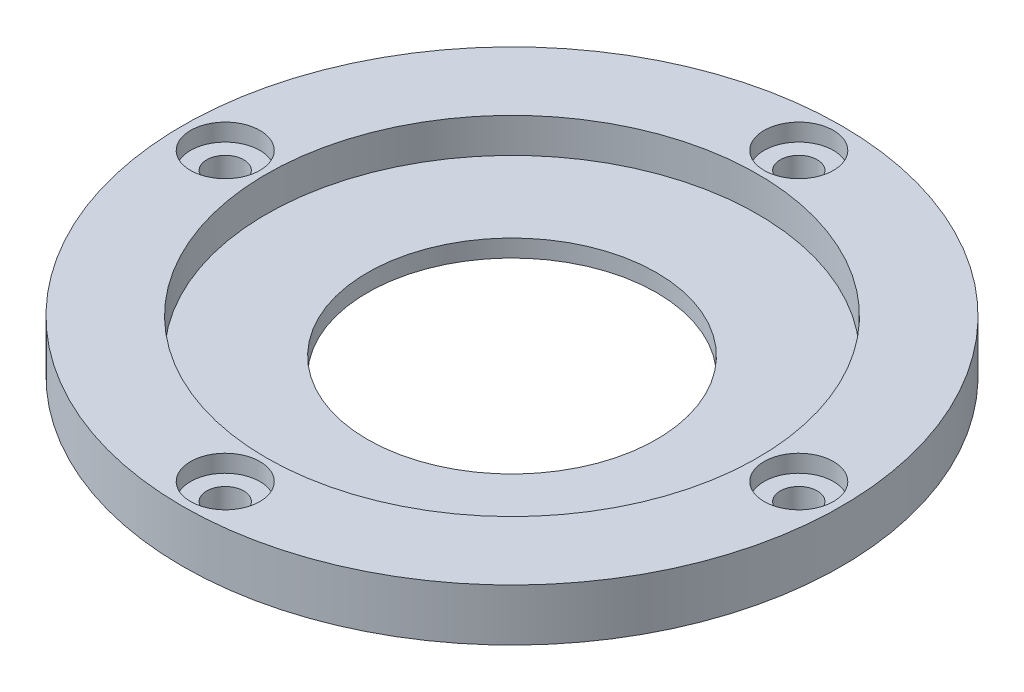
ISO-10303-21;
HEADER;
FILE_DESCRIPTION(('STEP AP214'),'2;1');
FILE_NAME('part.step','',(''),(''),'','','');
FILE_SCHEMA(('AUTOMOTIVE_DESIGN { 1 0 10303 214 1 1 1 1 }'));
ENDSEC;
DATA;
#1=APPLICATION_CONTEXT('core data for automotive mechanical design processes');
#2=APPLICATION_PROTOCOL_DEFINITION('international standard','automotive_design',2000,#1);
#3=PRODUCT_CONTEXT('',#1,'mechanical');
#4=PRODUCT('Part','Part','',(#3));
#5=PRODUCT_RELATED_PRODUCT_CATEGORY('part','',(#4));
#6=PRODUCT_DEFINITION_FORMATION('','',#4);
#7=PRODUCT_DEFINITION_CONTEXT('part definition',#1,'design');
#8=PRODUCT_DEFINITION('design','',#6,#7);
#9=PRODUCT_DEFINITION_SHAPE('','',#8);
#10=(LENGTH_UNIT() NAMED_UNIT(*) SI_UNIT(.MILLI.,.METRE.));
#11=(NAMED_UNIT(*) PLANE_ANGLE_UNIT() SI_UNIT($,.RADIAN.));
#12=(NAMED_UNIT(*) SI_UNIT($,.STERADIAN.) SOLID_ANGLE_UNIT());
#13=UNCERTAINTY_MEASURE_WITH_UNIT(LENGTH_MEASURE(1.E-05),#10,'distance_accuracy_value','');
#14=(GEOMETRIC_REPRESENTATION_CONTEXT(3) GLOBAL_UNCERTAINTY_ASSIGNED_CONTEXT((#13)) GLOBAL_UNIT_ASSIGNED_CONTEXT((#10,
#11,#12)) REPRESENTATION_CONTEXT('',''));
#15=CARTESIAN_POINT('',(0.,0.,0.));
#16=DIRECTION('',(0.,0.,1.));
#17=DIRECTION('',(1.,0.,0.));
#18=AXIS2_PLACEMENT_3D('',#15,#16,#17);
#19=CARTESIAN_POINT('',(0.,1.5,0.));
#20=DIRECTION('',(0.,1.,0.));
#21=DIRECTION('',(0.,0.,1.));
#22=AXIS2_PLACEMENT_3D('',#19,#20,#21);
#23=PLANE('',#22);
#24=CARTESIAN_POINT('',(0.,1.5,0.));
#25=DIRECTION('',(0.,1.,0.));
#26=DIRECTION('',(0.,0.,1.));
#27=AXIS2_PLACEMENT_3D('',#24,#25,#26);
#28=CIRCLE('',#27,12.5);
#29=CARTESIAN_POINT('',(0.,1.5,12.5));
#30=VERTEX_POINT('',#29);
#31=EDGE_CURVE('E40',#30,#30,#28,.T.);
#32=ORIENTED_EDGE('',*,*,#31,.F.);
#33=EDGE_LOOP('',(#32));
#34=FACE_BOUND('',#33,.T.);
#35=CARTESIAN_POINT('',(0.,1.5,0.));
#36=DIRECTION('',(0.,1.,0.));
#37=DIRECTION('',(0.,0.,1.));
#38=AXIS2_PLACEMENT_3D('',#35,#36,#37);
#39=CIRCLE('',#38,21.25);
#40=CARTESIAN_POINT('',(0.,1.5,21.25));
#41=VERTEX_POINT('',#40);
#42=EDGE_CURVE('E54',#41,#41,#39,.T.);
#43=ORIENTED_EDGE('',*,*,#42,.T.);
#44=EDGE_LOOP('',(#43));
#45=FACE_BOUND('',#44,.T.);
#46=ADVANCED_FACE('F33',(#34,#45),#23,.T.);
#47=CARTESIAN_POINT('',(0.,0.,0.));
#48=DIRECTION('',(0.,1.,0.));
#49=DIRECTION('',(0.,0.,1.));
#50=AXIS2_PLACEMENT_3D('',#47,#48,#49);
#51=PLANE('',#50);
#52=CARTESIAN_POINT('',(0.,0.,-24.8));
#53=DIRECTION('',(0.,1.,0.));
#54=DIRECTION('',(0.,0.,1.));
#55=AXIS2_PLACEMENT_3D('',#52,#53,#54);
#56=CIRCLE('',#55,1.6);
#57=CARTESIAN_POINT('',(0.,0.,-23.2));
#58=VERTEX_POINT('',#57);
#59=EDGE_CURVE('E64',#58,#58,#56,.T.);
#60=ORIENTED_EDGE('',*,*,#59,.T.);
#61=EDGE_LOOP('',(#60));
#62=FACE_BOUND('',#61,.T.);
#63=CARTESIAN_POINT('',(24.8,0.,0.));
#64=DIRECTION('',(0.,1.,0.));
#65=DIRECTION('',(0.,0.,1.));
#66=AXIS2_PLACEMENT_3D('',#63,#64,#65);
#67=CIRCLE('',#66,1.6);
#68=CARTESIAN_POINT('',(24.8,0.,1.60000000000009));
#69=VERTEX_POINT('',#68);
#70=EDGE_CURVE('E99',#69,#69,#67,.T.);
#71=ORIENTED_EDGE('',*,*,#70,.T.);
#72=EDGE_LOOP('',(#71));
#73=FACE_BOUND('',#72,.T.);
#74=CARTESIAN_POINT('',(6.95747021688363E-13,0.,24.8));
#75=DIRECTION('',(0.,1.,0.));
#76=DIRECTION('',(0.,0.,1.));
#77=AXIS2_PLACEMENT_3D('',#74,#75,#76);
#78=CIRCLE('',#77,1.60000000000083);
#79=CARTESIAN_POINT('',(6.95747021688363E-13,0.,26.4000000000008));
#80=VERTEX_POINT('',#79);
#81=EDGE_CURVE('E93',#80,#80,#78,.T.);
#82=ORIENTED_EDGE('',*,*,#81,.T.);
#83=EDGE_LOOP('',(#82));
#84=FACE_BOUND('',#83,.T.);
#85=CARTESIAN_POINT('',(-24.7999999999997,0.,3.50910634906067E-13));
#86=DIRECTION('',(0.,1.,0.));
#87=DIRECTION('',(0.,0.,1.));
#88=AXIS2_PLACEMENT_3D('',#85,#86,#87);
#89=CIRCLE('',#88,1.60000000000069);
#90=CARTESIAN_POINT('',(-24.7999999999997,0.,1.60000000000104));
#91=VERTEX_POINT('',#90);
#92=EDGE_CURVE('E87',#91,#91,#89,.T.);
#93=ORIENTED_EDGE('',*,*,#92,.T.);
#94=EDGE_LOOP('',(#93));
#95=FACE_BOUND('',#94,.T.);
#96=CARTESIAN_POINT('',(0.,0.,0.));
#97=DIRECTION('',(0.,1.,0.));
#98=DIRECTION('',(0.,0.,1.));
#99=AXIS2_PLACEMENT_3D('',#96,#97,#98);
#100=CIRCLE('',#99,28.5);
#101=CARTESIAN_POINT('',(0.,0.,28.5));
#102=VERTEX_POINT('',#101);
#103=EDGE_CURVE('E10',#102,#102,#100,.T.);
#104=ORIENTED_EDGE('',*,*,#103,.F.);
#105=EDGE_LOOP('',(#104));
#106=FACE_BOUND('',#105,.T.);
#107=CARTESIAN_POINT('',(0.,0.,0.));
#108=DIRECTION('',(0.,1.,0.));
#109=DIRECTION('',(0.,0.,1.));
#110=AXIS2_PLACEMENT_3D('',#107,#108,#109);
#111=CIRCLE('',#110,12.5);
#112=CARTESIAN_POINT('',(0.,0.,12.5));
#113=VERTEX_POINT('',#112);
#114=EDGE_CURVE('E44',#113,#113,#111,.T.);
#115=ORIENTED_EDGE('',*,*,#114,.T.);
#116=EDGE_LOOP('',(#115));
#117=FACE_BOUND('',#116,.T.);
#118=ADVANCED_FACE('F108',(#62,#73,#84,#95,#106,#117),#51,.F.);
#119=CARTESIAN_POINT('',(0.,1.5,0.));
#120=DIRECTION('',(0.,-1.,0.));
#121=DIRECTION('',(0.,0.,-1.));
#122=AXIS2_PLACEMENT_3D('',#119,#120,#121);
#123=CYLINDRICAL_SURFACE('',#122,28.5);
#124=ORIENTED_EDGE('',*,*,#103,.T.);
#125=EDGE_LOOP('',(#124));
#126=FACE_BOUND('',#125,.T.);
#127=CARTESIAN_POINT('',(0.,4.5,0.));
#128=DIRECTION('',(0.,1.,0.));
#129=DIRECTION('',(0.,0.,1.));
#130=AXIS2_PLACEMENT_3D('',#127,#128,#129);
#131=CIRCLE('',#130,28.5);
#132=CARTESIAN_POINT('',(0.,4.5,28.5));
#133=VERTEX_POINT('',#132);
#134=EDGE_CURVE('E49',#133,#133,#131,.T.);
#135=ORIENTED_EDGE('',*,*,#134,.F.);
#136=EDGE_LOOP('',(#135));
#137=FACE_BOUND('',#136,.T.);
#138=ADVANCED_FACE('F35',(#126,#137),#123,.T.);
#139=CARTESIAN_POINT('',(0.,1.5,0.));
#140=DIRECTION('',(0.,-1.,0.));
#141=DIRECTION('',(0.,0.,-1.));
#142=AXIS2_PLACEMENT_3D('',#139,#140,#141);
#143=CYLINDRICAL_SURFACE('',#142,12.5);
#144=ORIENTED_EDGE('',*,*,#31,.T.);
#145=EDGE_LOOP('',(#144));
#146=FACE_BOUND('',#145,.T.);
#147=ORIENTED_EDGE('',*,*,#114,.F.);
#148=EDGE_LOOP('',(#147));
#149=FACE_BOUND('',#148,.T.);
#150=ADVANCED_FACE('F136',(#146,#149),#143,.F.);
#151=CARTESIAN_POINT('',(0.,4.5,0.));
#152=DIRECTION('',(0.,1.,0.));
#153=DIRECTION('',(0.,0.,1.));
#154=AXIS2_PLACEMENT_3D('',#151,#152,#153);
#155=PLANE('',#154);
#156=CARTESIAN_POINT('',(0.,4.5,-24.8));
#157=DIRECTION('',(0.,1.,0.));
#158=DIRECTION('',(0.,0.,1.));
#159=AXIS2_PLACEMENT_3D('',#156,#157,#158);
#160=CIRCLE('',#159,3.);
#161=CARTESIAN_POINT('',(0.,4.5,-21.8));
#162=VERTEX_POINT('',#161);
#163=EDGE_CURVE('E79',#162,#162,#160,.T.);
#164=ORIENTED_EDGE('',*,*,#163,.F.);
#165=EDGE_LOOP('',(#164));
#166=FACE_BOUND('',#165,.T.);
#167=CARTESIAN_POINT('',(24.8,4.5,0.));
#168=DIRECTION('',(0.,1.,0.));
#169=DIRECTION('',(0.,0.,1.));
#170=AXIS2_PLACEMENT_3D('',#167,#168,#169);
#171=CIRCLE('',#170,3.);
#172=CARTESIAN_POINT('',(24.8,4.5,3.00000000000009));
#173=VERTEX_POINT('',#172);
#174=EDGE_CURVE('E73',#173,#173,#171,.T.);
#175=ORIENTED_EDGE('',*,*,#174,.F.);
#176=EDGE_LOOP('',(#175));
#177=FACE_BOUND('',#176,.T.);
#178=CARTESIAN_POINT('',(6.95747021688363E-13,4.5,24.8));
#179=DIRECTION('',(0.,1.,0.));
#180=DIRECTION('',(0.,0.,1.));
#181=AXIS2_PLACEMENT_3D('',#178,#179,#180);
#182=CIRCLE('',#181,3.00000000000083);
#183=CARTESIAN_POINT('',(6.95747021688363E-13,4.5,27.8000000000008));
#184=VERTEX_POINT('',#183);
#185=EDGE_CURVE('E67',#184,#184,#182,.T.);
#186=ORIENTED_EDGE('',*,*,#185,.F.);
#187=EDGE_LOOP('',(#186));
#188=FACE_BOUND('',#187,.T.);
#189=CARTESIAN_POINT('',(-24.7999999999997,4.5,3.50910634906067E-13));
#190=DIRECTION('',(0.,1.,0.));
#191=DIRECTION('',(0.,0.,1.));
#192=AXIS2_PLACEMENT_3D('',#189,#190,#191);
#193=CIRCLE('',#192,3.00000000000068);
#194=CARTESIAN_POINT('',(-24.7999999999997,4.5,3.00000000000104));
#195=VERTEX_POINT('',#194);
#196=EDGE_CURVE('E60',#195,#195,#193,.T.);
#197=ORIENTED_EDGE('',*,*,#196,.F.);
#198=EDGE_LOOP('',(#197));
#199=FACE_BOUND('',#198,.T.);
#200=ORIENTED_EDGE('',*,*,#134,.T.);
#201=EDGE_LOOP('',(#200));
#202=FACE_BOUND('',#201,.T.);
#203=CARTESIAN_POINT('',(0.,4.5,0.));
#204=DIRECTION('',(0.,1.,0.));
#205=DIRECTION('',(0.,0.,1.));
#206=AXIS2_PLACEMENT_3D('',#203,#204,#205);
#207=CIRCLE('',#206,21.25);
#208=CARTESIAN_POINT('',(0.,4.5,21.25));
#209=VERTEX_POINT('',#208);
#210=EDGE_CURVE('E53',#209,#209,#207,.T.);
#211=ORIENTED_EDGE('',*,*,#210,.F.);
#212=EDGE_LOOP('',(#211));
#213=FACE_BOUND('',#212,.T.);
#214=ADVANCED_FACE('F132',(#166,#177,#188,#199,#202,#213),#155,.T.);
#215=CARTESIAN_POINT('',(0.,4.5,0.));
#216=DIRECTION('',(0.,-1.,0.));
#217=DIRECTION('',(0.,0.,-1.));
#218=AXIS2_PLACEMENT_3D('',#215,#216,#217);
#219=CYLINDRICAL_SURFACE('',#218,21.25);
#220=ORIENTED_EDGE('',*,*,#210,.T.);
#221=EDGE_LOOP('',(#220));
#222=FACE_BOUND('',#221,.T.);
#223=ORIENTED_EDGE('',*,*,#42,.F.);
#224=EDGE_LOOP('',(#223));
#225=FACE_BOUND('',#224,.T.);
#226=ADVANCED_FACE('F135',(#222,#225),#219,.F.);
#227=CARTESIAN_POINT('',(-24.7999999999997,3.,3.50910634906067E-13));
#228=DIRECTION('',(0.,1.,0.));
#229=DIRECTION('',(0.,0.,1.));
#230=AXIS2_PLACEMENT_3D('',#227,#228,#229);
#231=CYLINDRICAL_SURFACE('',#230,3.00000000000068);
#232=CARTESIAN_POINT('',(-24.7999999999997,3.,3.50910634906067E-13));
#233=DIRECTION('',(0.,1.,0.));
#234=DIRECTION('',(0.,0.,1.));
#235=AXIS2_PLACEMENT_3D('',#232,#233,#234);
#236=CIRCLE('',#235,3.00000000000068);
#237=CARTESIAN_POINT('',(-24.7999999999997,3.,3.00000000000104));
#238=VERTEX_POINT('',#237);
#239=EDGE_CURVE('E63',#238,#238,#236,.T.);
#240=ORIENTED_EDGE('',*,*,#239,.F.);
#241=EDGE_LOOP('',(#240));
#242=FACE_BOUND('',#241,.T.);
#243=ORIENTED_EDGE('',*,*,#196,.T.);
#244=EDGE_LOOP('',(#243));
#245=FACE_BOUND('',#244,.T.);
#246=ADVANCED_FACE('F150',(#242,#245),#231,.F.);
#247=CARTESIAN_POINT('',(-24.7999999999997,3.,3.50910634906067E-13));
#248=DIRECTION('',(0.,1.,0.));
#249=DIRECTION('',(0.,0.,1.));
#250=AXIS2_PLACEMENT_3D('',#247,#248,#249);
#251=PLANE('',#250);
#252=CARTESIAN_POINT('',(-24.7999999999997,3.,3.50910634906067E-13));
#253=DIRECTION('',(0.,1.,0.));
#254=DIRECTION('',(0.,0.,1.));
#255=AXIS2_PLACEMENT_3D('',#252,#253,#254);
#256=CIRCLE('',#255,1.60000000000069);
#257=CARTESIAN_POINT('',(-24.7999999999997,3.,1.60000000000104));
#258=VERTEX_POINT('',#257);
#259=EDGE_CURVE('E84',#258,#258,#256,.T.);
#260=ORIENTED_EDGE('',*,*,#259,.F.);
#261=EDGE_LOOP('',(#260));
#262=FACE_BOUND('',#261,.T.);
#263=ORIENTED_EDGE('',*,*,#239,.T.);
#264=EDGE_LOOP('',(#263));
#265=FACE_BOUND('',#264,.T.);
#266=ADVANCED_FACE('F165',(#262,#265),#251,.T.);
#267=CARTESIAN_POINT('',(6.95747021688363E-13,3.,24.8));
#268=DIRECTION('',(0.,1.,0.));
#269=DIRECTION('',(0.,0.,1.));
#270=AXIS2_PLACEMENT_3D('',#267,#268,#269);
#271=CYLINDRICAL_SURFACE('',#270,3.00000000000083);
#272=CARTESIAN_POINT('',(6.95747021688363E-13,3.,24.8));
#273=DIRECTION('',(0.,1.,0.));
#274=DIRECTION('',(0.,0.,1.));
#275=AXIS2_PLACEMENT_3D('',#272,#273,#274);
#276=CIRCLE('',#275,3.00000000000083);
#277=CARTESIAN_POINT('',(6.95747021688363E-13,3.,27.8000000000008));
#278=VERTEX_POINT('',#277);
#279=EDGE_CURVE('E70',#278,#278,#276,.T.);
#280=ORIENTED_EDGE('',*,*,#279,.F.);
#281=EDGE_LOOP('',(#280));
#282=FACE_BOUND('',#281,.T.);
#283=ORIENTED_EDGE('',*,*,#185,.T.);
#284=EDGE_LOOP('',(#283));
#285=FACE_BOUND('',#284,.T.);
#286=ADVANCED_FACE('F169',(#282,#285),#271,.F.);
#287=CARTESIAN_POINT('',(6.95747021688363E-13,3.,24.8));
#288=DIRECTION('',(0.,1.,0.));
#289=DIRECTION('',(0.,0.,1.));
#290=AXIS2_PLACEMENT_3D('',#287,#288,#289);
#291=PLANE('',#290);
#292=CARTESIAN_POINT('',(6.95747021688363E-13,3.,24.8));
#293=DIRECTION('',(0.,1.,0.));
#294=DIRECTION('',(0.,0.,1.));
#295=AXIS2_PLACEMENT_3D('',#292,#293,#294);
#296=CIRCLE('',#295,1.60000000000083);
#297=CARTESIAN_POINT('',(6.95747021688363E-13,3.,26.4000000000008));
#298=VERTEX_POINT('',#297);
#299=EDGE_CURVE('E90',#298,#298,#296,.T.);
#300=ORIENTED_EDGE('',*,*,#299,.F.);
#301=EDGE_LOOP('',(#300));
#302=FACE_BOUND('',#301,.T.);
#303=ORIENTED_EDGE('',*,*,#279,.T.);
#304=EDGE_LOOP('',(#303));
#305=FACE_BOUND('',#304,.T.);
#306=ADVANCED_FACE('F173',(#302,#305),#291,.T.);
#307=CARTESIAN_POINT('',(24.8,3.,0.));
#308=DIRECTION('',(0.,1.,0.));
#309=DIRECTION('',(0.,0.,1.));
#310=AXIS2_PLACEMENT_3D('',#307,#308,#309);
#311=CYLINDRICAL_SURFACE('',#310,3.);
#312=CARTESIAN_POINT('',(24.8,3.,0.));
#313=DIRECTION('',(0.,1.,0.));
#314=DIRECTION('',(0.,0.,1.));
#315=AXIS2_PLACEMENT_3D('',#312,#313,#314);
#316=CIRCLE('',#315,3.);
#317=CARTESIAN_POINT('',(24.8,3.,3.00000000000009));
#318=VERTEX_POINT('',#317);
#319=EDGE_CURVE('E76',#318,#318,#316,.T.);
#320=ORIENTED_EDGE('',*,*,#319,.F.);
#321=EDGE_LOOP('',(#320));
#322=FACE_BOUND('',#321,.T.);
#323=ORIENTED_EDGE('',*,*,#174,.T.);
#324=EDGE_LOOP('',(#323));
#325=FACE_BOUND('',#324,.T.);
#326=ADVANCED_FACE('F177',(#322,#325),#311,.F.);
#327=CARTESIAN_POINT('',(24.8,3.,0.));
#328=DIRECTION('',(0.,1.,0.));
#329=DIRECTION('',(0.,0.,1.));
#330=AXIS2_PLACEMENT_3D('',#327,#328,#329);
#331=PLANE('',#330);
#332=CARTESIAN_POINT('',(24.8,3.,0.));
#333=DIRECTION('',(0.,1.,0.));
#334=DIRECTION('',(0.,0.,1.));
#335=AXIS2_PLACEMENT_3D('',#332,#333,#334);
#336=CIRCLE('',#335,1.6);
#337=CARTESIAN_POINT('',(24.8,3.,1.60000000000009));
#338=VERTEX_POINT('',#337);
#339=EDGE_CURVE('E96',#338,#338,#336,.T.);
#340=ORIENTED_EDGE('',*,*,#339,.F.);
#341=EDGE_LOOP('',(#340));
#342=FACE_BOUND('',#341,.T.);
#343=ORIENTED_EDGE('',*,*,#319,.T.);
#344=EDGE_LOOP('',(#343));
#345=FACE_BOUND('',#344,.T.);
#346=ADVANCED_FACE('F128',(#342,#345),#331,.T.);
#347=CARTESIAN_POINT('',(0.,3.,-24.8));
#348=DIRECTION('',(0.,1.,0.));
#349=DIRECTION('',(0.,0.,1.));
#350=AXIS2_PLACEMENT_3D('',#347,#348,#349);
#351=CYLINDRICAL_SURFACE('',#350,3.);
#352=CARTESIAN_POINT('',(0.,3.,-24.8));
#353=DIRECTION('',(0.,1.,0.));
#354=DIRECTION('',(0.,0.,1.));
#355=AXIS2_PLACEMENT_3D('',#352,#353,#354);
#356=CIRCLE('',#355,3.);
#357=CARTESIAN_POINT('',(0.,3.,-21.8));
#358=VERTEX_POINT('',#357);
#359=EDGE_CURVE('E57',#358,#358,#356,.T.);
#360=ORIENTED_EDGE('',*,*,#359,.F.);
#361=EDGE_LOOP('',(#360));
#362=FACE_BOUND('',#361,.T.);
#363=ORIENTED_EDGE('',*,*,#163,.T.);
#364=EDGE_LOOP('',(#363));
#365=FACE_BOUND('',#364,.T.);
#366=ADVANCED_FACE('F122',(#362,#365),#351,.F.);
#367=CARTESIAN_POINT('',(0.,3.,-24.8));
#368=DIRECTION('',(0.,1.,0.));
#369=DIRECTION('',(0.,0.,1.));
#370=AXIS2_PLACEMENT_3D('',#367,#368,#369);
#371=PLANE('',#370);
#372=CARTESIAN_POINT('',(0.,3.,-24.8));
#373=DIRECTION('',(0.,1.,0.));
#374=DIRECTION('',(0.,0.,1.));
#375=AXIS2_PLACEMENT_3D('',#372,#373,#374);
#376=CIRCLE('',#375,1.6);
#377=CARTESIAN_POINT('',(0.,3.,-23.2));
#378=VERTEX_POINT('',#377);
#379=EDGE_CURVE('E102',#378,#378,#376,.T.);
#380=ORIENTED_EDGE('',*,*,#379,.F.);
#381=EDGE_LOOP('',(#380));
#382=FACE_BOUND('',#381,.T.);
#383=ORIENTED_EDGE('',*,*,#359,.T.);
#384=EDGE_LOOP('',(#383));
#385=FACE_BOUND('',#384,.T.);
#386=ADVANCED_FACE('F118',(#382,#385),#371,.T.);
#387=CARTESIAN_POINT('',(-24.7999999999997,0.,3.50910634906067E-13));
#388=DIRECTION('',(0.,1.,0.));
#389=DIRECTION('',(0.,0.,1.));
#390=AXIS2_PLACEMENT_3D('',#387,#388,#389);
#391=CYLINDRICAL_SURFACE('',#390,1.60000000000069);
#392=CARTESIAN_POINT('',(-24.7999999999997,0.,1.60000000000104));
#393=CARTESIAN_POINT('',(-24.7999999999997,0.03125,1.60000000000104));
#394=CARTESIAN_POINT('',(-24.7999999999997,0.0625,1.60000000000104));
#395=CARTESIAN_POINT('',(-24.7999999999997,0.125,1.60000000000104));
#396=CARTESIAN_POINT('',(-24.7999999999997,0.15625,1.60000000000104));
#397=CARTESIAN_POINT('',(-24.7999999999997,0.21875,1.60000000000104));
#398=CARTESIAN_POINT('',(-24.7999999999997,0.25,1.60000000000104));
#399=CARTESIAN_POINT('',(-24.7999999999997,0.3125,1.60000000000104));
#400=CARTESIAN_POINT('',(-24.7999999999997,0.34375,1.60000000000104));
#401=CARTESIAN_POINT('',(-24.7999999999997,0.40625,1.60000000000104));
#402=CARTESIAN_POINT('',(-24.7999999999997,0.4375,1.60000000000104));
#403=CARTESIAN_POINT('',(-24.7999999999997,0.5,1.60000000000104));
#404=CARTESIAN_POINT('',(-24.7999999999997,0.53125,1.60000000000104));
#405=CARTESIAN_POINT('',(-24.7999999999997,0.59375,1.60000000000104));
#406=CARTESIAN_POINT('',(-24.7999999999997,0.625,1.60000000000104));
#407=CARTESIAN_POINT('',(-24.7999999999997,0.6875,1.60000000000104));
#408=CARTESIAN_POINT('',(-24.7999999999997,0.71875,1.60000000000104));
#409=CARTESIAN_POINT('',(-24.7999999999997,0.78125,1.60000000000104));
#410=CARTESIAN_POINT('',(-24.7999999999997,0.8125,1.60000000000104));
#411=CARTESIAN_POINT('',(-24.7999999999997,0.875,1.60000000000104));
#412=CARTESIAN_POINT('',(-24.7999999999997,0.90625,1.60000000000104));
#413=CARTESIAN_POINT('',(-24.7999999999997,0.96875,1.60000000000104));
#414=CARTESIAN_POINT('',(-24.7999999999997,1.,1.60000000000104));
#415=CARTESIAN_POINT('',(-24.7999999999997,1.0625,1.60000000000104));
#416=CARTESIAN_POINT('',(-24.7999999999997,1.09375,1.60000000000104));
#417=CARTESIAN_POINT('',(-24.7999999999997,1.15625,1.60000000000104));
#418=CARTESIAN_POINT('',(-24.7999999999997,1.1875,1.60000000000104));
#419=CARTESIAN_POINT('',(-24.7999999999997,1.25,1.60000000000104));
#420=CARTESIAN_POINT('',(-24.7999999999997,1.28125,1.60000000000104));
#421=CARTESIAN_POINT('',(-24.7999999999997,1.34375,1.60000000000104));
#422=CARTESIAN_POINT('',(-24.7999999999997,1.375,1.60000000000104));
#423=CARTESIAN_POINT('',(-24.7999999999997,1.4375,1.60000000000104));
#424=CARTESIAN_POINT('',(-24.7999999999997,1.46875,1.60000000000104));
#425=CARTESIAN_POINT('',(-24.7999999999997,1.53125,1.60000000000104));
#426=CARTESIAN_POINT('',(-24.7999999999997,1.5625,1.60000000000104));
#427=CARTESIAN_POINT('',(-24.7999999999997,1.625,1.60000000000104));
#428=CARTESIAN_POINT('',(-24.7999999999997,1.65625,1.60000000000104));
#429=CARTESIAN_POINT('',(-24.7999999999997,1.71875,1.60000000000104));
#430=CARTESIAN_POINT('',(-24.7999999999997,1.75,1.60000000000104));
#431=CARTESIAN_POINT('',(-24.7999999999997,1.8125,1.60000000000104));
#432=CARTESIAN_POINT('',(-24.7999999999997,1.84375,1.60000000000104));
#433=CARTESIAN_POINT('',(-24.7999999999997,1.90625,1.60000000000104));
#434=CARTESIAN_POINT('',(-24.7999999999997,1.9375,1.60000000000104));
#435=CARTESIAN_POINT('',(-24.7999999999997,2.,1.60000000000104));
#436=CARTESIAN_POINT('',(-24.7999999999997,2.03125,1.60000000000104));
#437=CARTESIAN_POINT('',(-24.7999999999997,2.09375,1.60000000000104));
#438=CARTESIAN_POINT('',(-24.7999999999997,2.125,1.60000000000104));
#439=CARTESIAN_POINT('',(-24.7999999999997,2.1875,1.60000000000104));
#440=CARTESIAN_POINT('',(-24.7999999999997,2.21875,1.60000000000104));
#441=CARTESIAN_POINT('',(-24.7999999999997,2.28125,1.60000000000104));
#442=CARTESIAN_POINT('',(-24.7999999999997,2.3125,1.60000000000104));
#443=CARTESIAN_POINT('',(-24.7999999999997,2.375,1.60000000000104));
#444=CARTESIAN_POINT('',(-24.7999999999997,2.40625,1.60000000000104));
#445=CARTESIAN_POINT('',(-24.7999999999997,2.46875,1.60000000000104));
#446=CARTESIAN_POINT('',(-24.7999999999997,2.5,1.60000000000104));
#447=CARTESIAN_POINT('',(-24.7999999999997,2.5625,1.60000000000104));
#448=CARTESIAN_POINT('',(-24.7999999999997,2.59375,1.60000000000104));
#449=CARTESIAN_POINT('',(-24.7999999999997,2.65625,1.60000000000104));
#450=CARTESIAN_POINT('',(-24.7999999999997,2.6875,1.60000000000104));
#451=CARTESIAN_POINT('',(-24.7999999999997,2.75,1.60000000000104));
#452=CARTESIAN_POINT('',(-24.7999999999997,2.78125,1.60000000000104));
#453=CARTESIAN_POINT('',(-24.7999999999997,2.84375,1.60000000000104));
#454=CARTESIAN_POINT('',(-24.7999999999997,2.875,1.60000000000104));
#455=CARTESIAN_POINT('',(-24.7999999999997,2.9375,1.60000000000104));
#456=CARTESIAN_POINT('',(-24.7999999999997,2.96875,1.60000000000104));
#457=CARTESIAN_POINT('',(-24.7999999999997,3.,1.60000000000104));
#458=B_SPLINE_CURVE_WITH_KNOTS('',3,(#392,#393,#394,#395,#396,#397,#398,#399,#400,#401,#402,
#403,#404,#405,#406,#407,#408,#409,#410,#411,#412,#413,#414,#415,#416,#417,#418,#419,#420,#421,
#422,#423,#424,#425,#426,#427,#428,#429,#430,#431,#432,#433,#434,#435,#436,#437,#438,#439,#440,
#441,#442,#443,#444,#445,#446,#447,#448,#449,#450,#451,#452,#453,#454,#455,#456,#457),
.UNSPECIFIED.,.F.,.F.,(4,2,2,2,2,2,2,2,2,2,2,2,2,2,2,2,2,2,2,2,2,2,2,2,2,2,2,2,2,2,2,2,4),(0.,
0.09375,0.1875,0.28125,0.375,0.46875,0.5625,0.65625,0.75,0.84375,0.9375,1.03125,1.125,1.21875,
1.3125,1.40625,1.5,1.59375,1.6875,1.78125,1.875,1.96875,2.0625,2.15625,2.25,2.34375,2.4375,
2.53125,2.625,2.71875,2.8125,2.90625,3.),.UNSPECIFIED.);
#459=EDGE_CURVE('BSEAM121',#91,#258,#458,.T.);
#460=ORIENTED_EDGE('',*,*,#92,.F.);
#461=ORIENTED_EDGE('',*,*,#259,.T.);
#462=ORIENTED_EDGE('',*,*,#459,.T.);
#463=ORIENTED_EDGE('',*,*,#459,.F.);
#464=EDGE_LOOP('',(#460,#462,#461,#463));
#465=FACE_BOUND('',#464,.T.);
#466=ADVANCED_FACE('F121',(#465),#391,.F.);
#467=CARTESIAN_POINT('',(6.95747021688363E-13,0.,24.8));
#468=DIRECTION('',(0.,1.,0.));
#469=DIRECTION('',(0.,0.,1.));
#470=AXIS2_PLACEMENT_3D('',#467,#468,#469);
#471=CYLINDRICAL_SURFACE('',#470,1.60000000000083);
#472=CARTESIAN_POINT('',(6.95747021688363E-13,0.,26.4000000000008));
#473=CARTESIAN_POINT('',(6.95747021688363E-13,0.03125,26.4000000000008));
#474=CARTESIAN_POINT('',(6.95747021688363E-13,0.0625,26.4000000000008));
#475=CARTESIAN_POINT('',(6.95747021688363E-13,0.125,26.4000000000008));
#476=CARTESIAN_POINT('',(6.95747021688363E-13,0.15625,26.4000000000008));
#477=CARTESIAN_POINT('',(6.95747021688363E-13,0.21875,26.4000000000008));
#478=CARTESIAN_POINT('',(6.95747021688363E-13,0.25,26.4000000000008));
#479=CARTESIAN_POINT('',(6.95747021688363E-13,0.3125,26.4000000000008));
#480=CARTESIAN_POINT('',(6.95747021688363E-13,0.34375,26.4000000000008));
#481=CARTESIAN_POINT('',(6.95747021688363E-13,0.40625,26.4000000000008));
#482=CARTESIAN_POINT('',(6.95747021688363E-13,0.4375,26.4000000000008));
#483=CARTESIAN_POINT('',(6.95747021688363E-13,0.5,26.4000000000008));
#484=CARTESIAN_POINT('',(6.95747021688363E-13,0.53125,26.4000000000008));
#485=CARTESIAN_POINT('',(6.95747021688363E-13,0.59375,26.4000000000008));
#486=CARTESIAN_POINT('',(6.95747021688363E-13,0.625,26.4000000000008));
#487=CARTESIAN_POINT('',(6.95747021688363E-13,0.6875,26.4000000000008));
#488=CARTESIAN_POINT('',(6.95747021688363E-13,0.71875,26.4000000000008));
#489=CARTESIAN_POINT('',(6.95747021688363E-13,0.78125,26.4000000000008));
#490=CARTESIAN_POINT('',(6.95747021688363E-13,0.8125,26.4000000000008));
#491=CARTESIAN_POINT('',(6.95747021688363E-13,0.875,26.4000000000008));
#492=CARTESIAN_POINT('',(6.95747021688363E-13,0.90625,26.4000000000008));
#493=CARTESIAN_POINT('',(6.95747021688363E-13,0.96875,26.4000000000008));
#494=CARTESIAN_POINT('',(6.95747021688363E-13,1.,26.4000000000008));
#495=CARTESIAN_POINT('',(6.95747021688363E-13,1.0625,26.4000000000008));
#496=CARTESIAN_POINT('',(6.95747021688363E-13,1.09375,26.4000000000008));
#497=CARTESIAN_POINT('',(6.95747021688363E-13,1.15625,26.4000000000008));
#498=CARTESIAN_POINT('',(6.95747021688363E-13,1.1875,26.4000000000008));
#499=CARTESIAN_POINT('',(6.95747021688363E-13,1.25,26.4000000000008));
#500=CARTESIAN_POINT('',(6.95747021688363E-13,1.28125,26.4000000000008));
#501=CARTESIAN_POINT('',(6.95747021688363E-13,1.34375,26.4000000000008));
#502=CARTESIAN_POINT('',(6.95747021688363E-13,1.375,26.4000000000008));
#503=CARTESIAN_POINT('',(6.95747021688363E-13,1.4375,26.4000000000008));
#504=CARTESIAN_POINT('',(6.95747021688363E-13,1.46875,26.4000000000008));
#505=CARTESIAN_POINT('',(6.95747021688363E-13,1.53125,26.4000000000008));
#506=CARTESIAN_POINT('',(6.95747021688363E-13,1.5625,26.4000000000008));
#507=CARTESIAN_POINT('',(6.95747021688363E-13,1.625,26.4000000000008));
#508=CARTESIAN_POINT('',(6.95747021688363E-13,1.65625,26.4000000000008));
#509=CARTESIAN_POINT('',(6.95747021688363E-13,1.71875,26.4000000000008));
#510=CARTESIAN_POINT('',(6.95747021688363E-13,1.75,26.4000000000008));
#511=CARTESIAN_POINT('',(6.95747021688363E-13,1.8125,26.4000000000008));
#512=CARTESIAN_POINT('',(6.95747021688363E-13,1.84375,26.4000000000008));
#513=CARTESIAN_POINT('',(6.95747021688363E-13,1.90625,26.4000000000008));
#514=CARTESIAN_POINT('',(6.95747021688363E-13,1.9375,26.4000000000008));
#515=CARTESIAN_POINT('',(6.95747021688363E-13,2.,26.4000000000008));
#516=CARTESIAN_POINT('',(6.95747021688363E-13,2.03125,26.4000000000008));
#517=CARTESIAN_POINT('',(6.95747021688363E-13,2.09375,26.4000000000008));
#518=CARTESIAN_POINT('',(6.95747021688363E-13,2.125,26.4000000000008));
#519=CARTESIAN_POINT('',(6.95747021688363E-13,2.1875,26.4000000000008));
#520=CARTESIAN_POINT('',(6.95747021688363E-13,2.21875,26.4000000000008));
#521=CARTESIAN_POINT('',(6.95747021688363E-13,2.28125,26.4000000000008));
#522=CARTESIAN_POINT('',(6.95747021688363E-13,2.3125,26.4000000000008));
#523=CARTESIAN_POINT('',(6.95747021688363E-13,2.375,26.4000000000008));
#524=CARTESIAN_POINT('',(6.95747021688363E-13,2.40625,26.4000000000008));
#525=CARTESIAN_POINT('',(6.95747021688363E-13,2.46875,26.4000000000008));
#526=CARTESIAN_POINT('',(6.95747021688363E-13,2.5,26.4000000000008));
#527=CARTESIAN_POINT('',(6.95747021688363E-13,2.5625,26.4000000000008));
#528=CARTESIAN_POINT('',(6.95747021688363E-13,2.59375,26.4000000000008));
#529=CARTESIAN_POINT('',(6.95747021688363E-13,2.65625,26.4000000000008));
#530=CARTESIAN_POINT('',(6.95747021688363E-13,2.6875,26.4000000000008));
#531=CARTESIAN_POINT('',(6.95747021688363E-13,2.75,26.4000000000008));
#532=CARTESIAN_POINT('',(6.95747021688363E-13,2.78125,26.4000000000008));
#533=CARTESIAN_POINT('',(6.95747021688363E-13,2.84375,26.4000000000008));
#534=CARTESIAN_POINT('',(6.95747021688363E-13,2.875,26.4000000000008));
#535=CARTESIAN_POINT('',(6.95747021688363E-13,2.9375,26.4000000000008));
#536=CARTESIAN_POINT('',(6.95747021688363E-13,2.96875,26.4000000000008));
#537=CARTESIAN_POINT('',(6.95747021688363E-13,3.,26.4000000000008));
#538=B_SPLINE_CURVE_WITH_KNOTS('',3,(#472,#473,#474,#475,#476,#477,#478,#479,#480,#481,#482,
#483,#484,#485,#486,#487,#488,#489,#490,#491,#492,#493,#494,#495,#496,#497,#498,#499,#500,#501,
#502,#503,#504,#505,#506,#507,#508,#509,#510,#511,#512,#513,#514,#515,#516,#517,#518,#519,#520,
#521,#522,#523,#524,#525,#526,#527,#528,#529,#530,#531,#532,#533,#534,#535,#536,#537),
.UNSPECIFIED.,.F.,.F.,(4,2,2,2,2,2,2,2,2,2,2,2,2,2,2,2,2,2,2,2,2,2,2,2,2,2,2,2,2,2,2,2,4),(0.,
0.09375,0.1875,0.28125,0.375,0.46875,0.5625,0.65625,0.75,0.84375,0.9375,1.03125,1.125,1.21875,
1.3125,1.40625,1.5,1.59375,1.6875,1.78125,1.875,1.96875,2.0625,2.15625,2.25,2.34375,2.4375,
2.53125,2.625,2.71875,2.8125,2.90625,3.),.UNSPECIFIED.);
#539=EDGE_CURVE('BSEAM187',#80,#298,#538,.T.);
#540=ORIENTED_EDGE('',*,*,#81,.F.);
#541=ORIENTED_EDGE('',*,*,#299,.T.);
#542=ORIENTED_EDGE('',*,*,#539,.T.);
#543=ORIENTED_EDGE('',*,*,#539,.F.);
#544=EDGE_LOOP('',(#540,#542,#541,#543));
#545=FACE_BOUND('',#544,.T.);
#546=ADVANCED_FACE('F187',(#545),#471,.F.);
#547=CARTESIAN_POINT('',(24.8,0.,0.));
#548=DIRECTION('',(0.,1.,0.));
#549=DIRECTION('',(0.,0.,1.));
#550=AXIS2_PLACEMENT_3D('',#547,#548,#549);
#551=CYLINDRICAL_SURFACE('',#550,1.6);
#552=CARTESIAN_POINT('',(24.8,0.,1.60000000000009));
#553=CARTESIAN_POINT('',(24.8,0.03125,1.60000000000009));
#554=CARTESIAN_POINT('',(24.8,0.0625,1.60000000000009));
#555=CARTESIAN_POINT('',(24.8,0.125,1.60000000000009));
#556=CARTESIAN_POINT('',(24.8,0.15625,1.60000000000009));
#557=CARTESIAN_POINT('',(24.8,0.21875,1.60000000000009));
#558=CARTESIAN_POINT('',(24.8,0.25,1.60000000000009));
#559=CARTESIAN_POINT('',(24.8,0.3125,1.60000000000009));
#560=CARTESIAN_POINT('',(24.8,0.34375,1.60000000000009));
#561=CARTESIAN_POINT('',(24.8,0.40625,1.60000000000009));
#562=CARTESIAN_POINT('',(24.8,0.4375,1.60000000000009));
#563=CARTESIAN_POINT('',(24.8,0.5,1.60000000000009));
#564=CARTESIAN_POINT('',(24.8,0.53125,1.60000000000009));
#565=CARTESIAN_POINT('',(24.8,0.59375,1.60000000000009));
#566=CARTESIAN_POINT('',(24.8,0.625,1.60000000000009));
#567=CARTESIAN_POINT('',(24.8,0.6875,1.60000000000009));
#568=CARTESIAN_POINT('',(24.8,0.71875,1.60000000000009));
#569=CARTESIAN_POINT('',(24.8,0.78125,1.60000000000009));
#570=CARTESIAN_POINT('',(24.8,0.8125,1.60000000000009));
#571=CARTESIAN_POINT('',(24.8,0.875,1.60000000000009));
#572=CARTESIAN_POINT('',(24.8,0.90625,1.60000000000009));
#573=CARTESIAN_POINT('',(24.8,0.96875,1.60000000000009));
#574=CARTESIAN_POINT('',(24.8,1.,1.60000000000009));
#575=CARTESIAN_POINT('',(24.8,1.0625,1.60000000000009));
#576=CARTESIAN_POINT('',(24.8,1.09375,1.60000000000009));
#577=CARTESIAN_POINT('',(24.8,1.15625,1.60000000000009));
#578=CARTESIAN_POINT('',(24.8,1.1875,1.60000000000009));
#579=CARTESIAN_POINT('',(24.8,1.25,1.60000000000009));
#580=CARTESIAN_POINT('',(24.8,1.28125,1.60000000000009));
#581=CARTESIAN_POINT('',(24.8,1.34375,1.60000000000009));
#582=CARTESIAN_POINT('',(24.8,1.375,1.60000000000009));
#583=CARTESIAN_POINT('',(24.8,1.4375,1.60000000000009));
#584=CARTESIAN_POINT('',(24.8,1.46875,1.60000000000009));
#585=CARTESIAN_POINT('',(24.8,1.53125,1.60000000000009));
#586=CARTESIAN_POINT('',(24.8,1.5625,1.60000000000009));
#587=CARTESIAN_POINT('',(24.8,1.625,1.60000000000009));
#588=CARTESIAN_POINT('',(24.8,1.65625,1.60000000000009));
#589=CARTESIAN_POINT('',(24.8,1.71875,1.60000000000009));
#590=CARTESIAN_POINT('',(24.8,1.75,1.60000000000009));
#591=CARTESIAN_POINT('',(24.8,1.8125,1.60000000000009));
#592=CARTESIAN_POINT('',(24.8,1.84375,1.60000000000009));
#593=CARTESIAN_POINT('',(24.8,1.90625,1.60000000000009));
#594=CARTESIAN_POINT('',(24.8,1.9375,1.60000000000009));
#595=CARTESIAN_POINT('',(24.8,2.,1.60000000000009));
#596=CARTESIAN_POINT('',(24.8,2.03125,1.60000000000009));
#597=CARTESIAN_POINT('',(24.8,2.09375,1.60000000000009));
#598=CARTESIAN_POINT('',(24.8,2.125,1.60000000000009));
#599=CARTESIAN_POINT('',(24.8,2.1875,1.60000000000009));
#600=CARTESIAN_POINT('',(24.8,2.21875,1.60000000000009));
#601=CARTESIAN_POINT('',(24.8,2.28125,1.60000000000009));
#602=CARTESIAN_POINT('',(24.8,2.3125,1.60000000000009));
#603=CARTESIAN_POINT('',(24.8,2.375,1.60000000000009));
#604=CARTESIAN_POINT('',(24.8,2.40625,1.60000000000009));
#605=CARTESIAN_POINT('',(24.8,2.46875,1.60000000000009));
#606=CARTESIAN_POINT('',(24.8,2.5,1.60000000000009));
#607=CARTESIAN_POINT('',(24.8,2.5625,1.60000000000009));
#608=CARTESIAN_POINT('',(24.8,2.59375,1.60000000000009));
#609=CARTESIAN_POINT('',(24.8,2.65625,1.60000000000009));
#610=CARTESIAN_POINT('',(24.8,2.6875,1.60000000000009));
#611=CARTESIAN_POINT('',(24.8,2.75,1.60000000000009));
#612=CARTESIAN_POINT('',(24.8,2.78125,1.60000000000009));
#613=CARTESIAN_POINT('',(24.8,2.84375,1.60000000000009));
#614=CARTESIAN_POINT('',(24.8,2.875,1.60000000000009));
#615=CARTESIAN_POINT('',(24.8,2.9375,1.60000000000009));
#616=CARTESIAN_POINT('',(24.8,2.96875,1.60000000000009));
#617=CARTESIAN_POINT('',(24.8,3.,1.60000000000009));
#618=B_SPLINE_CURVE_WITH_KNOTS('',3,(#552,#553,#554,#555,#556,#557,#558,#559,#560,#561,#562,
#563,#564,#565,#566,#567,#568,#569,#570,#571,#572,#573,#574,#575,#576,#577,#578,#579,#580,#581,
#582,#583,#584,#585,#586,#587,#588,#589,#590,#591,#592,#593,#594,#595,#596,#597,#598,#599,#600,
#601,#602,#603,#604,#605,#606,#607,#608,#609,#610,#611,#612,#613,#614,#615,#616,#617),
.UNSPECIFIED.,.F.,.F.,(4,2,2,2,2,2,2,2,2,2,2,2,2,2,2,2,2,2,2,2,2,2,2,2,2,2,2,2,2,2,2,2,4),(0.,
0.09375,0.1875,0.28125,0.375,0.46875,0.5625,0.65625,0.75,0.84375,0.9375,1.03125,1.125,1.21875,
1.3125,1.40625,1.5,1.59375,1.6875,1.78125,1.875,1.96875,2.0625,2.15625,2.25,2.34375,2.4375,
2.53125,2.625,2.71875,2.8125,2.90625,3.),.UNSPECIFIED.);
#619=EDGE_CURVE('BSEAM114',#69,#338,#618,.T.);
#620=ORIENTED_EDGE('',*,*,#70,.F.);
#621=ORIENTED_EDGE('',*,*,#339,.T.);
#622=ORIENTED_EDGE('',*,*,#619,.T.);
#623=ORIENTED_EDGE('',*,*,#619,.F.);
#624=EDGE_LOOP('',(#620,#622,#621,#623));
#625=FACE_BOUND('',#624,.T.);
#626=ADVANCED_FACE('F114',(#625),#551,.F.);
#627=CARTESIAN_POINT('',(0.,0.,-24.8));
#628=DIRECTION('',(0.,1.,0.));
#629=DIRECTION('',(0.,0.,1.));
#630=AXIS2_PLACEMENT_3D('',#627,#628,#629);
#631=CYLINDRICAL_SURFACE('',#630,1.6);
#632=CARTESIAN_POINT('',(0.,0.,-23.2));
#633=CARTESIAN_POINT('',(0.,0.03125,-23.2));
#634=CARTESIAN_POINT('',(0.,0.0625,-23.2));
#635=CARTESIAN_POINT('',(0.,0.125,-23.2));
#636=CARTESIAN_POINT('',(0.,0.15625,-23.2));
#637=CARTESIAN_POINT('',(0.,0.21875,-23.2));
#638=CARTESIAN_POINT('',(0.,0.25,-23.2));
#639=CARTESIAN_POINT('',(0.,0.3125,-23.2));
#640=CARTESIAN_POINT('',(0.,0.34375,-23.2));
#641=CARTESIAN_POINT('',(0.,0.40625,-23.2));
#642=CARTESIAN_POINT('',(0.,0.4375,-23.2));
#643=CARTESIAN_POINT('',(0.,0.5,-23.2));
#644=CARTESIAN_POINT('',(0.,0.53125,-23.2));
#645=CARTESIAN_POINT('',(0.,0.59375,-23.2));
#646=CARTESIAN_POINT('',(0.,0.625,-23.2));
#647=CARTESIAN_POINT('',(0.,0.6875,-23.2));
#648=CARTESIAN_POINT('',(0.,0.71875,-23.2));
#649=CARTESIAN_POINT('',(0.,0.78125,-23.2));
#650=CARTESIAN_POINT('',(0.,0.8125,-23.2));
#651=CARTESIAN_POINT('',(0.,0.875,-23.2));
#652=CARTESIAN_POINT('',(0.,0.90625,-23.2));
#653=CARTESIAN_POINT('',(0.,0.96875,-23.2));
#654=CARTESIAN_POINT('',(0.,1.,-23.2));
#655=CARTESIAN_POINT('',(0.,1.0625,-23.2));
#656=CARTESIAN_POINT('',(0.,1.09375,-23.2));
#657=CARTESIAN_POINT('',(0.,1.15625,-23.2));
#658=CARTESIAN_POINT('',(0.,1.1875,-23.2));
#659=CARTESIAN_POINT('',(0.,1.25,-23.2));
#660=CARTESIAN_POINT('',(0.,1.28125,-23.2));
#661=CARTESIAN_POINT('',(0.,1.34375,-23.2));
#662=CARTESIAN_POINT('',(0.,1.375,-23.2));
#663=CARTESIAN_POINT('',(0.,1.4375,-23.2));
#664=CARTESIAN_POINT('',(0.,1.46875,-23.2));
#665=CARTESIAN_POINT('',(0.,1.53125,-23.2));
#666=CARTESIAN_POINT('',(0.,1.5625,-23.2));
#667=CARTESIAN_POINT('',(0.,1.625,-23.2));
#668=CARTESIAN_POINT('',(0.,1.65625,-23.2));
#669=CARTESIAN_POINT('',(0.,1.71875,-23.2));
#670=CARTESIAN_POINT('',(0.,1.75,-23.2));
#671=CARTESIAN_POINT('',(0.,1.8125,-23.2));
#672=CARTESIAN_POINT('',(0.,1.84375,-23.2));
#673=CARTESIAN_POINT('',(0.,1.90625,-23.2));
#674=CARTESIAN_POINT('',(0.,1.9375,-23.2));
#675=CARTESIAN_POINT('',(0.,2.,-23.2));
#676=CARTESIAN_POINT('',(0.,2.03125,-23.2));
#677=CARTESIAN_POINT('',(0.,2.09375,-23.2));
#678=CARTESIAN_POINT('',(0.,2.125,-23.2));
#679=CARTESIAN_POINT('',(0.,2.1875,-23.2));
#680=CARTESIAN_POINT('',(0.,2.21875,-23.2));
#681=CARTESIAN_POINT('',(0.,2.28125,-23.2));
#682=CARTESIAN_POINT('',(0.,2.3125,-23.2));
#683=CARTESIAN_POINT('',(0.,2.375,-23.2));
#684=CARTESIAN_POINT('',(0.,2.40625,-23.2));
#685=CARTESIAN_POINT('',(0.,2.46875,-23.2));
#686=CARTESIAN_POINT('',(0.,2.5,-23.2));
#687=CARTESIAN_POINT('',(0.,2.5625,-23.2));
#688=CARTESIAN_POINT('',(0.,2.59375,-23.2));
#689=CARTESIAN_POINT('',(0.,2.65625,-23.2));
#690=CARTESIAN_POINT('',(0.,2.6875,-23.2));
#691=CARTESIAN_POINT('',(0.,2.75,-23.2));
#692=CARTESIAN_POINT('',(0.,2.78125,-23.2));
#693=CARTESIAN_POINT('',(0.,2.84375,-23.2));
#694=CARTESIAN_POINT('',(0.,2.875,-23.2));
#695=CARTESIAN_POINT('',(0.,2.9375,-23.2));
#696=CARTESIAN_POINT('',(0.,2.96875,-23.2));
#697=CARTESIAN_POINT('',(0.,3.,-23.2));
#698=B_SPLINE_CURVE_WITH_KNOTS('',3,(#632,#633,#634,#635,#636,#637,#638,#639,#640,#641,#642,
#643,#644,#645,#646,#647,#648,#649,#650,#651,#652,#653,#654,#655,#656,#657,#658,#659,#660,#661,
#662,#663,#664,#665,#666,#667,#668,#669,#670,#671,#672,#673,#674,#675,#676,#677,#678,#679,#680,
#681,#682,#683,#684,#685,#686,#687,#688,#689,#690,#691,#692,#693,#694,#695,#696,#697),
.UNSPECIFIED.,.F.,.F.,(4,2,2,2,2,2,2,2,2,2,2,2,2,2,2,2,2,2,2,2,2,2,2,2,2,2,2,2,2,2,2,2,4),(0.,
0.09375,0.1875,0.28125,0.375,0.46875,0.5625,0.65625,0.75,0.84375,0.9375,1.03125,1.125,1.21875,
1.3125,1.40625,1.5,1.59375,1.6875,1.78125,1.875,1.96875,2.0625,2.15625,2.25,2.34375,2.4375,
2.53125,2.625,2.71875,2.8125,2.90625,3.),.UNSPECIFIED.);
#699=EDGE_CURVE('BSEAM111',#58,#378,#698,.T.);
#700=ORIENTED_EDGE('',*,*,#59,.F.);
#701=ORIENTED_EDGE('',*,*,#379,.T.);
#702=ORIENTED_EDGE('',*,*,#699,.T.);
#703=ORIENTED_EDGE('',*,*,#699,.F.);
#704=EDGE_LOOP('',(#700,#702,#701,#703));
#705=FACE_BOUND('',#704,.T.);
#706=ADVANCED_FACE('F111',(#705),#631,.F.);
#707=CLOSED_SHELL('',(#46,#118,#138,#150,#214,#226,#246,#266,#286,#306,#326,#346,#366,#386,#466,
#546,#626,#706));
#708=MANIFOLD_SOLID_BREP('B2',#707);
#709=ADVANCED_BREP_SHAPE_REPRESENTATION('',(#18,#708),#14);
#710=SHAPE_DEFINITION_REPRESENTATION(#9,#709);
ENDSEC;
END-ISO-10303-21;
